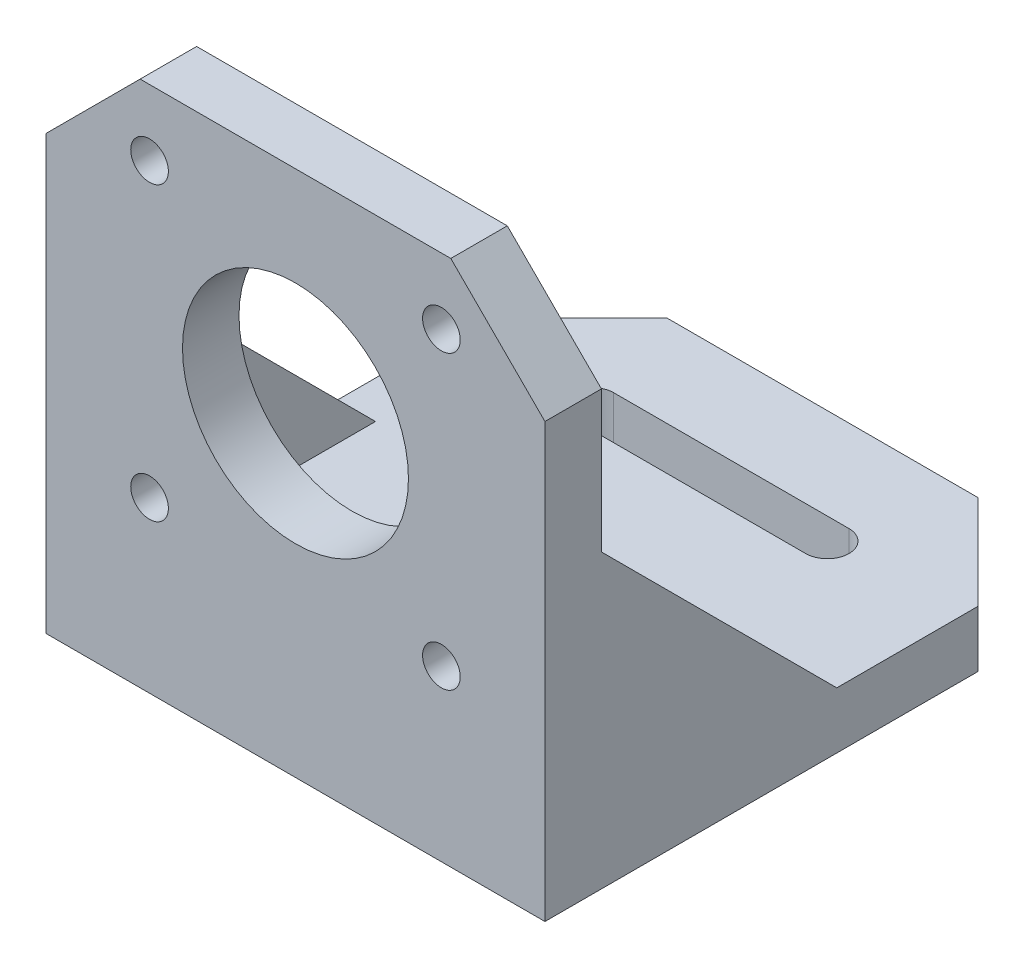
ISO-10303-21;
HEADER;
FILE_DESCRIPTION(('STEP AP214'),'2;1');
FILE_NAME('part.step','',(''),(''),'','','');
FILE_SCHEMA(('AUTOMOTIVE_DESIGN { 1 0 10303 214 1 1 1 1 }'));
ENDSEC;
DATA;
#1=APPLICATION_CONTEXT('core data for automotive mechanical design processes');
#2=APPLICATION_PROTOCOL_DEFINITION('international standard','automotive_design',2000,#1);
#3=PRODUCT_CONTEXT('',#1,'mechanical');
#4=PRODUCT('Part','Part','',(#3));
#5=PRODUCT_RELATED_PRODUCT_CATEGORY('part','',(#4));
#6=PRODUCT_DEFINITION_FORMATION('','',#4);
#7=PRODUCT_DEFINITION_CONTEXT('part definition',#1,'design');
#8=PRODUCT_DEFINITION('design','',#6,#7);
#9=PRODUCT_DEFINITION_SHAPE('','',#8);
#10=(LENGTH_UNIT() NAMED_UNIT(*) SI_UNIT(.MILLI.,.METRE.));
#11=(NAMED_UNIT(*) PLANE_ANGLE_UNIT() SI_UNIT($,.RADIAN.));
#12=(NAMED_UNIT(*) SI_UNIT($,.STERADIAN.) SOLID_ANGLE_UNIT());
#13=UNCERTAINTY_MEASURE_WITH_UNIT(LENGTH_MEASURE(1.E-05),#10,'distance_accuracy_value','');
#14=(GEOMETRIC_REPRESENTATION_CONTEXT(3) GLOBAL_UNCERTAINTY_ASSIGNED_CONTEXT((#13)) GLOBAL_UNIT_ASSIGNED_CONTEXT((#10,
#11,#12)) REPRESENTATION_CONTEXT('',''));
#15=CARTESIAN_POINT('',(0.,0.,0.));
#16=DIRECTION('',(0.,0.,1.));
#17=DIRECTION('',(1.,0.,0.));
#18=AXIS2_PLACEMENT_3D('',#15,#16,#17);
#19=CARTESIAN_POINT('',(4.,6.00000000000001,-31.));
#20=DIRECTION('',(0.,0.707106781186548,-0.707106781186547));
#21=DIRECTION('',(0.,0.707106781186547,0.707106781186548));
#22=AXIS2_PLACEMENT_3D('',#19,#20,#21);
#23=PLANE('',#22);
#24=DIRECTION('',(0.,-0.707106781186547,-0.707106781186548));
#25=VECTOR('',#24,1.);
#26=CARTESIAN_POINT('',(0.,6.00000000000001,-31.));
#27=LINE('',#26,#25);
#28=CARTESIAN_POINT('',(0.,31.,-5.99999999999999));
#29=VERTEX_POINT('',#28);
#30=CARTESIAN_POINT('',(0.,6.00000000000001,-31.));
#31=VERTEX_POINT('',#30);
#32=EDGE_CURVE('E97',#29,#31,#27,.T.);
#33=ORIENTED_EDGE('',*,*,#32,.F.);
#34=DIRECTION('',(-1.,0.,0.));
#35=VECTOR('',#34,1.);
#36=CARTESIAN_POINT('',(4.,31.,-5.99999999999999));
#37=LINE('',#36,#35);
#38=CARTESIAN_POINT('',(4.,31.,-5.99999999999999));
#39=VERTEX_POINT('',#38);
#40=EDGE_CURVE('E12',#39,#29,#37,.T.);
#41=ORIENTED_EDGE('',*,*,#40,.F.);
#42=DIRECTION('',(0.,-0.707106781186547,-0.707106781186548));
#43=VECTOR('',#42,1.);
#44=CARTESIAN_POINT('',(4.,6.00000000000001,-31.));
#45=LINE('',#44,#43);
#46=CARTESIAN_POINT('',(4.,6.00000000000001,-31.));
#47=VERTEX_POINT('',#46);
#48=EDGE_CURVE('E89',#39,#47,#45,.T.);
#49=ORIENTED_EDGE('',*,*,#48,.T.);
#50=DIRECTION('',(-1.,0.,0.));
#51=VECTOR('',#50,1.);
#52=CARTESIAN_POINT('',(4.,6.00000000000001,-31.));
#53=LINE('',#52,#51);
#54=EDGE_CURVE('E48',#47,#31,#53,.T.);
#55=ORIENTED_EDGE('',*,*,#54,.T.);
#56=EDGE_LOOP('',(#33,#41,#49,#55));
#57=FACE_BOUND('',#56,.T.);
#58=ADVANCED_FACE('F45',(#57),#23,.T.);
#59=CARTESIAN_POINT('',(4.,31.,-5.99999999999999));
#60=DIRECTION('',(0.,0.,1.));
#61=DIRECTION('',(0.,-1.,0.));
#62=AXIS2_PLACEMENT_3D('',#59,#60,#61);
#63=PLANE('',#62);
#64=DIRECTION('',(0.,1.,0.));
#65=VECTOR('',#64,1.);
#66=CARTESIAN_POINT('',(0.,31.,-5.99999999999999));
#67=LINE('',#66,#65);
#68=CARTESIAN_POINT('',(0.,6.00000000000001,-6.));
#69=VERTEX_POINT('',#68);
#70=EDGE_CURVE('E91',#69,#29,#67,.T.);
#71=ORIENTED_EDGE('',*,*,#70,.F.);
#72=DIRECTION('',(-1.,0.,0.));
#73=VECTOR('',#72,1.);
#74=CARTESIAN_POINT('',(4.,6.00000000000001,-6.));
#75=LINE('',#74,#73);
#76=CARTESIAN_POINT('',(4.,6.00000000000001,-6.));
#77=VERTEX_POINT('',#76);
#78=EDGE_CURVE('E54',#77,#69,#75,.T.);
#79=ORIENTED_EDGE('',*,*,#78,.F.);
#80=DIRECTION('',(0.,1.,0.));
#81=VECTOR('',#80,1.);
#82=CARTESIAN_POINT('',(4.,31.,-5.99999999999999));
#83=LINE('',#82,#81);
#84=EDGE_CURVE('E86',#77,#39,#83,.T.);
#85=ORIENTED_EDGE('',*,*,#84,.T.);
#86=ORIENTED_EDGE('',*,*,#40,.T.);
#87=EDGE_LOOP('',(#71,#79,#85,#86));
#88=FACE_BOUND('',#87,.T.);
#89=ADVANCED_FACE('F101',(#88),#63,.T.);
#90=CARTESIAN_POINT('',(4.,6.00000000000001,-6.));
#91=DIRECTION('',(0.,-1.,0.));
#92=DIRECTION('',(0.,0.,-1.));
#93=AXIS2_PLACEMENT_3D('',#90,#91,#92);
#94=PLANE('',#93);
#95=DIRECTION('',(0.,0.,1.));
#96=VECTOR('',#95,1.);
#97=CARTESIAN_POINT('',(0.,6.00000000000001,-6.));
#98=LINE('',#97,#96);
#99=EDGE_CURVE('E84',#31,#69,#98,.T.);
#100=ORIENTED_EDGE('',*,*,#99,.F.);
#101=ORIENTED_EDGE('',*,*,#54,.F.);
#102=DIRECTION('',(0.,0.,1.));
#103=VECTOR('',#102,1.);
#104=CARTESIAN_POINT('',(4.,6.00000000000001,-6.));
#105=LINE('',#104,#103);
#106=EDGE_CURVE('E82',#47,#77,#105,.T.);
#107=ORIENTED_EDGE('',*,*,#106,.T.);
#108=ORIENTED_EDGE('',*,*,#78,.T.);
#109=EDGE_LOOP('',(#100,#101,#107,#108));
#110=FACE_BOUND('',#109,.T.);
#111=ADVANCED_FACE('F81',(#110),#94,.T.);
#112=CARTESIAN_POINT('',(4.,0.,0.));
#113=DIRECTION('',(1.,0.,0.));
#114=DIRECTION('',(0.,0.,-1.));
#115=AXIS2_PLACEMENT_3D('',#112,#113,#114);
#116=PLANE('',#115);
#117=ORIENTED_EDGE('',*,*,#48,.F.);
#118=ORIENTED_EDGE('',*,*,#84,.F.);
#119=ORIENTED_EDGE('',*,*,#106,.F.);
#120=EDGE_LOOP('',(#117,#118,#119));
#121=FACE_BOUND('',#120,.T.);
#122=ADVANCED_FACE('F88',(#121),#116,.T.);
#123=CARTESIAN_POINT('',(0.,0.,0.));
#124=DIRECTION('',(1.,0.,0.));
#125=DIRECTION('',(0.,0.,-1.));
#126=AXIS2_PLACEMENT_3D('',#123,#124,#125);
#127=PLANE('',#126);
#128=ORIENTED_EDGE('',*,*,#32,.T.);
#129=ORIENTED_EDGE('',*,*,#99,.T.);
#130=ORIENTED_EDGE('',*,*,#70,.T.);
#131=EDGE_LOOP('',(#128,#129,#130));
#132=FACE_BOUND('',#131,.T.);
#133=ADVANCED_FACE('F100',(#132),#127,.F.);
#134=CLOSED_SHELL('',(#58,#89,#111,#122,#133));
#135=MANIFOLD_SOLID_BREP('B2',#134);
#136=CARTESIAN_POINT('',(53.,0.,-56.));
#137=DIRECTION('',(0.,1.,0.));
#138=DIRECTION('',(0.,0.,1.));
#139=AXIS2_PLACEMENT_3D('',#136,#137,#138);
#140=PLANE('',#139);
#141=DIRECTION('',(1.,0.,0.));
#142=VECTOR('',#141,1.);
#143=CARTESIAN_POINT('',(44.,0.,-11.7));
#144=LINE('',#143,#142);
#145=CARTESIAN_POINT('',(9.00000000000001,0.,-11.7));
#146=VERTEX_POINT('',#145);
#147=CARTESIAN_POINT('',(44.,0.,-11.7));
#148=VERTEX_POINT('',#147);
#149=EDGE_CURVE('E297',#146,#148,#144,.T.);
#150=ORIENTED_EDGE('',*,*,#149,.T.);
#151=CARTESIAN_POINT('',(44.,0.,-14.));
#152=DIRECTION('',(0.,1.,0.));
#153=DIRECTION('',(0.,0.,1.));
#154=AXIS2_PLACEMENT_3D('',#151,#152,#153);
#155=CIRCLE('',#154,2.3);
#156=CARTESIAN_POINT('',(44.,0.,-16.3));
#157=VERTEX_POINT('',#156);
#158=EDGE_CURVE('E289',#148,#157,#155,.T.);
#159=ORIENTED_EDGE('',*,*,#158,.T.);
#160=DIRECTION('',(-1.,0.,0.));
#161=VECTOR('',#160,1.);
#162=CARTESIAN_POINT('',(44.,0.,-16.3));
#163=LINE('',#162,#161);
#164=CARTESIAN_POINT('',(9.00000000000001,0.,-16.3));
#165=VERTEX_POINT('',#164);
#166=EDGE_CURVE('E301',#157,#165,#163,.T.);
#167=ORIENTED_EDGE('',*,*,#166,.T.);
#168=CARTESIAN_POINT('',(9.00000000000001,0.,-14.));
#169=DIRECTION('',(0.,1.,0.));
#170=DIRECTION('',(0.,0.,1.));
#171=AXIS2_PLACEMENT_3D('',#168,#169,#170);
#172=CIRCLE('',#171,2.3);
#173=EDGE_CURVE('E305',#165,#146,#172,.T.);
#174=ORIENTED_EDGE('',*,*,#173,.T.);
#175=EDGE_LOOP('',(#150,#159,#167,#174));
#176=FACE_BOUND('',#175,.T.);
#177=DIRECTION('',(1.,0.,0.));
#178=VECTOR('',#177,1.);
#179=CARTESIAN_POINT('',(39.,0.,-41.7));
#180=LINE('',#179,#178);
#181=CARTESIAN_POINT('',(14.,0.,-41.7));
#182=VERTEX_POINT('',#181);
#183=CARTESIAN_POINT('',(39.,0.,-41.7));
#184=VERTEX_POINT('',#183);
#185=EDGE_CURVE('E339',#182,#184,#180,.T.);
#186=ORIENTED_EDGE('',*,*,#185,.T.);
#187=CARTESIAN_POINT('',(39.,0.,-44.));
#188=DIRECTION('',(0.,1.,0.));
#189=DIRECTION('',(0.,0.,1.));
#190=AXIS2_PLACEMENT_3D('',#187,#188,#189);
#191=CIRCLE('',#190,2.29999999999999);
#192=CARTESIAN_POINT('',(39.,0.,-46.3));
#193=VERTEX_POINT('',#192);
#194=EDGE_CURVE('E329',#184,#193,#191,.T.);
#195=ORIENTED_EDGE('',*,*,#194,.T.);
#196=DIRECTION('',(-1.,0.,0.));
#197=VECTOR('',#196,1.);
#198=CARTESIAN_POINT('',(39.,0.,-46.3));
#199=LINE('',#198,#197);
#200=CARTESIAN_POINT('',(14.,0.,-46.3));
#201=VERTEX_POINT('',#200);
#202=EDGE_CURVE('E332',#193,#201,#199,.T.);
#203=ORIENTED_EDGE('',*,*,#202,.T.);
#204=CARTESIAN_POINT('',(14.,0.,-44.));
#205=DIRECTION('',(0.,1.,0.));
#206=DIRECTION('',(0.,0.,1.));
#207=AXIS2_PLACEMENT_3D('',#204,#205,#206);
#208=CIRCLE('',#207,2.29999999999999);
#209=EDGE_CURVE('E336',#201,#182,#208,.T.);
#210=ORIENTED_EDGE('',*,*,#209,.T.);
#211=EDGE_LOOP('',(#186,#195,#203,#210));
#212=FACE_BOUND('',#211,.T.);
#213=DIRECTION('',(0.,0.,-1.));
#214=VECTOR('',#213,1.);
#215=CARTESIAN_POINT('',(0.,0.,-56.));
#216=LINE('',#215,#214);
#217=CARTESIAN_POINT('',(0.,0.,0.));
#218=VERTEX_POINT('',#217);
#219=CARTESIAN_POINT('',(0.,0.,-46.));
#220=VERTEX_POINT('',#219);
#221=EDGE_CURVE('E393',#218,#220,#216,.T.);
#222=ORIENTED_EDGE('',*,*,#221,.T.);
#223=DIRECTION('',(0.707106781186547,0.,-0.707106781186548));
#224=VECTOR('',#223,1.);
#225=CARTESIAN_POINT('',(10.,0.,-56.));
#226=LINE('',#225,#224);
#227=CARTESIAN_POINT('',(10.,0.,-56.));
#228=VERTEX_POINT('',#227);
#229=EDGE_CURVE('E471',#220,#228,#226,.T.);
#230=ORIENTED_EDGE('',*,*,#229,.T.);
#231=DIRECTION('',(-1.,0.,0.));
#232=VECTOR('',#231,1.);
#233=CARTESIAN_POINT('',(53.,0.,-56.));
#234=LINE('',#233,#232);
#235=CARTESIAN_POINT('',(43.,0.,-56.));
#236=VERTEX_POINT('',#235);
#237=EDGE_CURVE('E426',#236,#228,#234,.T.);
#238=ORIENTED_EDGE('',*,*,#237,.F.);
#239=DIRECTION('',(-0.707106781186549,0.,-0.707106781186546));
#240=VECTOR('',#239,1.);
#241=CARTESIAN_POINT('',(53.,0.,-46.));
#242=LINE('',#241,#240);
#243=CARTESIAN_POINT('',(53.,0.,-46.));
#244=VERTEX_POINT('',#243);
#245=EDGE_CURVE('E469',#236,#244,#242,.F.);
#246=ORIENTED_EDGE('',*,*,#245,.T.);
#247=DIRECTION('',(0.,0.,-1.));
#248=VECTOR('',#247,1.);
#249=CARTESIAN_POINT('',(53.,0.,-56.));
#250=LINE('',#249,#248);
#251=CARTESIAN_POINT('',(53.,0.,0.));
#252=VERTEX_POINT('',#251);
#253=EDGE_CURVE('E396',#252,#244,#250,.T.);
#254=ORIENTED_EDGE('',*,*,#253,.F.);
#255=DIRECTION('',(-1.,0.,0.));
#256=VECTOR('',#255,1.);
#257=CARTESIAN_POINT('',(53.,0.,0.));
#258=LINE('',#257,#256);
#259=EDGE_CURVE('E407',#252,#218,#258,.T.);
#260=ORIENTED_EDGE('',*,*,#259,.T.);
#261=EDGE_LOOP('',(#222,#230,#238,#246,#254,#260));
#262=FACE_BOUND('',#261,.T.);
#263=ADVANCED_FACE('F143',(#176,#212,#262),#140,.F.);
#264=CARTESIAN_POINT('',(53.,6.00000000000001,-56.));
#265=DIRECTION('',(0.,0.,1.));
#266=DIRECTION('',(0.,-1.,0.));
#267=AXIS2_PLACEMENT_3D('',#264,#265,#266);
#268=PLANE('',#267);
#269=ORIENTED_EDGE('',*,*,#237,.T.);
#270=DIRECTION('',(0.,1.,0.));
#271=VECTOR('',#270,1.);
#272=CARTESIAN_POINT('',(10.,6.00000000000001,-56.));
#273=LINE('',#272,#271);
#274=CARTESIAN_POINT('',(10.,6.00000000000001,-56.));
#275=VERTEX_POINT('',#274);
#276=EDGE_CURVE('E460',#228,#275,#273,.T.);
#277=ORIENTED_EDGE('',*,*,#276,.T.);
#278=DIRECTION('',(-1.,0.,0.));
#279=VECTOR('',#278,1.);
#280=CARTESIAN_POINT('',(53.,6.00000000000001,-56.));
#281=LINE('',#280,#279);
#282=CARTESIAN_POINT('',(43.,6.00000000000001,-56.));
#283=VERTEX_POINT('',#282);
#284=EDGE_CURVE('E423',#283,#275,#281,.T.);
#285=ORIENTED_EDGE('',*,*,#284,.F.);
#286=DIRECTION('',(0.,-1.,0.));
#287=VECTOR('',#286,1.);
#288=CARTESIAN_POINT('',(43.,6.00000000000001,-56.));
#289=LINE('',#288,#287);
#290=EDGE_CURVE('E458',#283,#236,#289,.T.);
#291=ORIENTED_EDGE('',*,*,#290,.T.);
#292=EDGE_LOOP('',(#269,#277,#285,#291));
#293=FACE_BOUND('',#292,.T.);
#294=ADVANCED_FACE('F497',(#293),#268,.F.);
#295=CARTESIAN_POINT('',(53.,6.00000000000001,-6.));
#296=DIRECTION('',(0.,-1.,0.));
#297=DIRECTION('',(0.,0.,-1.));
#298=AXIS2_PLACEMENT_3D('',#295,#296,#297);
#299=PLANE('',#298);
#300=DIRECTION('',(-1.,0.,0.));
#301=VECTOR('',#300,1.);
#302=CARTESIAN_POINT('',(44.,6.00000000000001,-16.3));
#303=LINE('',#302,#301);
#304=CARTESIAN_POINT('',(44.,6.00000000000001,-16.3));
#305=VERTEX_POINT('',#304);
#306=CARTESIAN_POINT('',(9.00000000000001,6.00000000000001,-16.3));
#307=VERTEX_POINT('',#306);
#308=EDGE_CURVE('E318',#305,#307,#303,.T.);
#309=ORIENTED_EDGE('',*,*,#308,.F.);
#310=CARTESIAN_POINT('',(44.,6.00000000000001,-14.));
#311=DIRECTION('',(0.,1.,0.));
#312=DIRECTION('',(0.,0.,1.));
#313=AXIS2_PLACEMENT_3D('',#310,#311,#312);
#314=CIRCLE('',#313,2.3);
#315=CARTESIAN_POINT('',(44.,6.00000000000001,-11.7));
#316=VERTEX_POINT('',#315);
#317=EDGE_CURVE('E292',#316,#305,#314,.T.);
#318=ORIENTED_EDGE('',*,*,#317,.F.);
#319=DIRECTION('',(1.,0.,0.));
#320=VECTOR('',#319,1.);
#321=CARTESIAN_POINT('',(44.,6.00000000000001,-11.7));
#322=LINE('',#321,#320);
#323=CARTESIAN_POINT('',(9.00000000000001,6.00000000000001,-11.7));
#324=VERTEX_POINT('',#323);
#325=EDGE_CURVE('E309',#324,#316,#322,.T.);
#326=ORIENTED_EDGE('',*,*,#325,.F.);
#327=CARTESIAN_POINT('',(9.00000000000001,6.00000000000001,-14.));
#328=DIRECTION('',(0.,1.,0.));
#329=DIRECTION('',(0.,0.,1.));
#330=AXIS2_PLACEMENT_3D('',#327,#328,#329);
#331=CIRCLE('',#330,2.3);
#332=EDGE_CURVE('E312',#307,#324,#331,.T.);
#333=ORIENTED_EDGE('',*,*,#332,.F.);
#334=EDGE_LOOP('',(#309,#318,#326,#333));
#335=FACE_BOUND('',#334,.T.);
#336=DIRECTION('',(-1.,0.,0.));
#337=VECTOR('',#336,1.);
#338=CARTESIAN_POINT('',(39.,6.00000000000001,-46.3));
#339=LINE('',#338,#337);
#340=CARTESIAN_POINT('',(39.,6.00000000000001,-46.3));
#341=VERTEX_POINT('',#340);
#342=CARTESIAN_POINT('',(14.,6.00000000000001,-46.3));
#343=VERTEX_POINT('',#342);
#344=EDGE_CURVE('E345',#341,#343,#339,.T.);
#345=ORIENTED_EDGE('',*,*,#344,.F.);
#346=CARTESIAN_POINT('',(39.,6.00000000000001,-44.));
#347=DIRECTION('',(0.,1.,0.));
#348=DIRECTION('',(0.,0.,1.));
#349=AXIS2_PLACEMENT_3D('',#346,#347,#348);
#350=CIRCLE('',#349,2.29999999999999);
#351=CARTESIAN_POINT('',(39.,6.00000000000001,-41.7));
#352=VERTEX_POINT('',#351);
#353=EDGE_CURVE('E343',#352,#341,#350,.T.);
#354=ORIENTED_EDGE('',*,*,#353,.F.);
#355=DIRECTION('',(1.,0.,0.));
#356=VECTOR('',#355,1.);
#357=CARTESIAN_POINT('',(39.,6.00000000000001,-41.7));
#358=LINE('',#357,#356);
#359=CARTESIAN_POINT('',(14.,6.00000000000001,-41.7));
#360=VERTEX_POINT('',#359);
#361=EDGE_CURVE('E333',#360,#352,#358,.T.);
#362=ORIENTED_EDGE('',*,*,#361,.F.);
#363=CARTESIAN_POINT('',(14.,6.00000000000001,-44.));
#364=DIRECTION('',(0.,1.,0.));
#365=DIRECTION('',(0.,0.,1.));
#366=AXIS2_PLACEMENT_3D('',#363,#364,#365);
#367=CIRCLE('',#366,2.29999999999999);
#368=EDGE_CURVE('E348',#343,#360,#367,.T.);
#369=ORIENTED_EDGE('',*,*,#368,.F.);
#370=EDGE_LOOP('',(#345,#354,#362,#369));
#371=FACE_BOUND('',#370,.T.);
#372=DIRECTION('',(0.,0.,1.));
#373=VECTOR('',#372,1.);
#374=CARTESIAN_POINT('',(0.,6.00000000000001,-6.));
#375=LINE('',#374,#373);
#376=CARTESIAN_POINT('',(0.,6.00000000000001,-46.));
#377=VERTEX_POINT('',#376);
#378=CARTESIAN_POINT('',(0.,6.00000000000001,-9.));
#379=VERTEX_POINT('',#378);
#380=EDGE_CURVE('E410',#377,#379,#375,.T.);
#381=ORIENTED_EDGE('',*,*,#380,.T.);
#382=DIRECTION('',(-1.,0.,0.));
#383=VECTOR('',#382,1.);
#384=CARTESIAN_POINT('',(49.,6.00000000000001,-9.));
#385=LINE('',#384,#383);
#386=CARTESIAN_POINT('',(49.,6.00000000000001,-9.));
#387=VERTEX_POINT('',#386);
#388=EDGE_CURVE('E158',#379,#387,#385,.F.);
#389=ORIENTED_EDGE('',*,*,#388,.T.);
#390=DIRECTION('',(0.,0.,-1.));
#391=VECTOR('',#390,1.);
#392=CARTESIAN_POINT('',(49.,6.00000000000001,-31.));
#393=LINE('',#392,#391);
#394=CARTESIAN_POINT('',(49.,6.00000000000001,-31.));
#395=VERTEX_POINT('',#394);
#396=EDGE_CURVE('E383',#387,#395,#393,.T.);
#397=ORIENTED_EDGE('',*,*,#396,.T.);
#398=DIRECTION('',(1.,0.,0.));
#399=VECTOR('',#398,1.);
#400=CARTESIAN_POINT('',(49.,6.00000000000001,-31.));
#401=LINE('',#400,#399);
#402=CARTESIAN_POINT('',(53.,6.00000000000001,-31.));
#403=VERTEX_POINT('',#402);
#404=EDGE_CURVE('E388',#395,#403,#401,.T.);
#405=ORIENTED_EDGE('',*,*,#404,.T.);
#406=DIRECTION('',(0.,0.,1.));
#407=VECTOR('',#406,1.);
#408=CARTESIAN_POINT('',(53.,6.00000000000001,-6.));
#409=LINE('',#408,#407);
#410=CARTESIAN_POINT('',(53.,6.00000000000001,-46.));
#411=VERTEX_POINT('',#410);
#412=EDGE_CURVE('E399',#411,#403,#409,.T.);
#413=ORIENTED_EDGE('',*,*,#412,.F.);
#414=DIRECTION('',(0.707106781186549,0.,0.707106781186546));
#415=VECTOR('',#414,1.);
#416=CARTESIAN_POINT('',(53.,6.00000000000001,-46.));
#417=LINE('',#416,#415);
#418=EDGE_CURVE('E463',#411,#283,#417,.F.);
#419=ORIENTED_EDGE('',*,*,#418,.T.);
#420=ORIENTED_EDGE('',*,*,#284,.T.);
#421=DIRECTION('',(-0.707106781186547,0.,0.707106781186548));
#422=VECTOR('',#421,1.);
#423=CARTESIAN_POINT('',(10.,6.00000000000001,-56.));
#424=LINE('',#423,#422);
#425=EDGE_CURVE('E465',#275,#377,#424,.T.);
#426=ORIENTED_EDGE('',*,*,#425,.T.);
#427=EDGE_LOOP('',(#381,#389,#397,#405,#413,#419,#420,#426));
#428=FACE_BOUND('',#427,.T.);
#429=ADVANCED_FACE('F502',(#335,#371,#428),#299,.F.);
#430=CARTESIAN_POINT('',(53.,56.,-5.99999999999999));
#431=DIRECTION('',(0.,0.,1.));
#432=DIRECTION('',(0.,-1.,0.));
#433=AXIS2_PLACEMENT_3D('',#430,#431,#432);
#434=PLANE('',#433);
#435=CARTESIAN_POINT('',(26.5,33.5,-5.99999999999999));
#436=DIRECTION('',(0.,0.,1.));
#437=DIRECTION('',(0.,-1.,0.));
#438=AXIS2_PLACEMENT_3D('',#435,#436,#437);
#439=CIRCLE('',#438,12.);
#440=CARTESIAN_POINT('',(26.5,21.5,-5.99999999999999));
#441=VERTEX_POINT('',#440);
#442=EDGE_CURVE('E376',#441,#441,#439,.T.);
#443=ORIENTED_EDGE('',*,*,#442,.T.);
#444=EDGE_LOOP('',(#443));
#445=FACE_BOUND('',#444,.T.);
#446=CARTESIAN_POINT('',(11.,18.,-6.));
#447=DIRECTION('',(0.,0.,1.));
#448=DIRECTION('',(0.,-1.,0.));
#449=AXIS2_PLACEMENT_3D('',#446,#447,#448);
#450=CIRCLE('',#449,2.);
#451=CARTESIAN_POINT('',(11.,16.,-6.));
#452=VERTEX_POINT('',#451);
#453=EDGE_CURVE('E372',#452,#452,#450,.T.);
#454=ORIENTED_EDGE('',*,*,#453,.T.);
#455=EDGE_LOOP('',(#454));
#456=FACE_BOUND('',#455,.T.);
#457=CARTESIAN_POINT('',(42.,18.,-6.));
#458=DIRECTION('',(0.,0.,1.));
#459=DIRECTION('',(0.,-1.,0.));
#460=AXIS2_PLACEMENT_3D('',#457,#458,#459);
#461=CIRCLE('',#460,2.);
#462=CARTESIAN_POINT('',(42.,16.,-6.));
#463=VERTEX_POINT('',#462);
#464=EDGE_CURVE('E368',#463,#463,#461,.T.);
#465=ORIENTED_EDGE('',*,*,#464,.T.);
#466=EDGE_LOOP('',(#465));
#467=FACE_BOUND('',#466,.T.);
#468=CARTESIAN_POINT('',(42.,49.,-5.99999999999999));
#469=DIRECTION('',(0.,0.,1.));
#470=DIRECTION('',(0.,-1.,0.));
#471=AXIS2_PLACEMENT_3D('',#468,#469,#470);
#472=CIRCLE('',#471,2.);
#473=CARTESIAN_POINT('',(42.,47.,-5.99999999999999));
#474=VERTEX_POINT('',#473);
#475=EDGE_CURVE('E364',#474,#474,#472,.T.);
#476=ORIENTED_EDGE('',*,*,#475,.T.);
#477=EDGE_LOOP('',(#476));
#478=FACE_BOUND('',#477,.T.);
#479=CARTESIAN_POINT('',(11.,49.,-5.99999999999999));
#480=DIRECTION('',(0.,0.,1.));
#481=DIRECTION('',(0.,-1.,0.));
#482=AXIS2_PLACEMENT_3D('',#479,#480,#481);
#483=CIRCLE('',#482,2.);
#484=CARTESIAN_POINT('',(11.,47.,-5.99999999999999));
#485=VERTEX_POINT('',#484);
#486=EDGE_CURVE('E360',#485,#485,#483,.T.);
#487=ORIENTED_EDGE('',*,*,#486,.T.);
#488=EDGE_LOOP('',(#487));
#489=FACE_BOUND('',#488,.T.);
#490=DIRECTION('',(0.,-1.,0.));
#491=VECTOR('',#490,1.);
#492=CARTESIAN_POINT('',(49.,6.00000000000001,-6.));
#493=LINE('',#492,#491);
#494=CARTESIAN_POINT('',(49.,31.,-5.99999999999999));
#495=VERTEX_POINT('',#494);
#496=CARTESIAN_POINT('',(49.,9.00000000000001,-6.));
#497=VERTEX_POINT('',#496);
#498=EDGE_CURVE('E380',#495,#497,#493,.T.);
#499=ORIENTED_EDGE('',*,*,#498,.T.);
#500=DIRECTION('',(-1.,0.,0.));
#501=VECTOR('',#500,1.);
#502=CARTESIAN_POINT('',(0.,9.00000000000001,-6.));
#503=LINE('',#502,#501);
#504=CARTESIAN_POINT('',(0.,9.00000000000002,-6.));
#505=VERTEX_POINT('',#504);
#506=EDGE_CURVE('E476',#497,#505,#503,.T.);
#507=ORIENTED_EDGE('',*,*,#506,.T.);
#508=DIRECTION('',(0.,1.,0.));
#509=VECTOR('',#508,1.);
#510=CARTESIAN_POINT('',(0.,56.,-5.99999999999999));
#511=LINE('',#510,#509);
#512=CARTESIAN_POINT('',(0.,46.,-5.99999999999999));
#513=VERTEX_POINT('',#512);
#514=EDGE_CURVE('E412',#505,#513,#511,.T.);
#515=ORIENTED_EDGE('',*,*,#514,.T.);
#516=DIRECTION('',(0.707106781186547,0.707106781186549,0.));
#517=VECTOR('',#516,1.);
#518=CARTESIAN_POINT('',(10.,56.,-5.99999999999999));
#519=LINE('',#518,#517);
#520=CARTESIAN_POINT('',(10.,56.,-5.99999999999999));
#521=VERTEX_POINT('',#520);
#522=EDGE_CURVE('E451',#513,#521,#519,.T.);
#523=ORIENTED_EDGE('',*,*,#522,.T.);
#524=DIRECTION('',(-1.,0.,0.));
#525=VECTOR('',#524,1.);
#526=CARTESIAN_POINT('',(53.,56.,-5.99999999999999));
#527=LINE('',#526,#525);
#528=CARTESIAN_POINT('',(43.,56.,-5.99999999999999));
#529=VERTEX_POINT('',#528);
#530=EDGE_CURVE('E420',#529,#521,#527,.T.);
#531=ORIENTED_EDGE('',*,*,#530,.F.);
#532=DIRECTION('',(-0.707106781186549,0.707106781186546,0.));
#533=VECTOR('',#532,1.);
#534=CARTESIAN_POINT('',(53.,46.,-5.99999999999999));
#535=LINE('',#534,#533);
#536=CARTESIAN_POINT('',(53.,46.,-5.99999999999999));
#537=VERTEX_POINT('',#536);
#538=EDGE_CURVE('E453',#529,#537,#535,.F.);
#539=ORIENTED_EDGE('',*,*,#538,.T.);
#540=DIRECTION('',(0.,1.,0.));
#541=VECTOR('',#540,1.);
#542=CARTESIAN_POINT('',(53.,56.,-5.99999999999999));
#543=LINE('',#542,#541);
#544=CARTESIAN_POINT('',(53.,31.,-5.99999999999999));
#545=VERTEX_POINT('',#544);
#546=EDGE_CURVE('E402',#545,#537,#543,.T.);
#547=ORIENTED_EDGE('',*,*,#546,.F.);
#548=DIRECTION('',(1.,0.,0.));
#549=VECTOR('',#548,1.);
#550=CARTESIAN_POINT('',(49.,31.,-5.99999999999999));
#551=LINE('',#550,#549);
#552=EDGE_CURVE('E391',#495,#545,#551,.T.);
#553=ORIENTED_EDGE('',*,*,#552,.F.);
#554=EDGE_LOOP('',(#499,#507,#515,#523,#531,#539,#547,#553));
#555=FACE_BOUND('',#554,.T.);
#556=ADVANCED_FACE('F487',(#445,#456,#467,#478,#489,#555),#434,.F.);
#557=CARTESIAN_POINT('',(53.,56.,0.));
#558=DIRECTION('',(0.,-1.,0.));
#559=DIRECTION('',(0.,0.,-1.));
#560=AXIS2_PLACEMENT_3D('',#557,#558,#559);
#561=PLANE('',#560);
#562=DIRECTION('',(-1.,0.,0.));
#563=VECTOR('',#562,1.);
#564=CARTESIAN_POINT('',(53.,56.,0.));
#565=LINE('',#564,#563);
#566=CARTESIAN_POINT('',(43.,56.,0.));
#567=VERTEX_POINT('',#566);
#568=CARTESIAN_POINT('',(10.,56.,0.));
#569=VERTEX_POINT('',#568);
#570=EDGE_CURVE('E417',#567,#569,#565,.T.);
#571=ORIENTED_EDGE('',*,*,#570,.F.);
#572=DIRECTION('',(0.,0.,-1.));
#573=VECTOR('',#572,1.);
#574=CARTESIAN_POINT('',(43.,56.,0.));
#575=LINE('',#574,#573);
#576=EDGE_CURVE('E449',#567,#529,#575,.T.);
#577=ORIENTED_EDGE('',*,*,#576,.T.);
#578=ORIENTED_EDGE('',*,*,#530,.T.);
#579=DIRECTION('',(0.,0.,1.));
#580=VECTOR('',#579,1.);
#581=CARTESIAN_POINT('',(10.,56.,0.));
#582=LINE('',#581,#580);
#583=EDGE_CURVE('E446',#521,#569,#582,.T.);
#584=ORIENTED_EDGE('',*,*,#583,.T.);
#585=EDGE_LOOP('',(#571,#577,#578,#584));
#586=FACE_BOUND('',#585,.T.);
#587=ADVANCED_FACE('F565',(#586),#561,.F.);
#588=CARTESIAN_POINT('',(53.,0.,0.));
#589=DIRECTION('',(0.,0.,-1.));
#590=DIRECTION('',(-1.,0.,0.));
#591=AXIS2_PLACEMENT_3D('',#588,#589,#590);
#592=PLANE('',#591);
#593=CARTESIAN_POINT('',(26.5,33.5,0.));
#594=DIRECTION('',(0.,0.,-1.));
#595=DIRECTION('',(-1.,0.,0.));
#596=AXIS2_PLACEMENT_3D('',#593,#594,#595);
#597=CIRCLE('',#596,12.);
#598=CARTESIAN_POINT('',(14.5,33.5,0.));
#599=VERTEX_POINT('',#598);
#600=EDGE_CURVE('E375',#599,#599,#597,.T.);
#601=ORIENTED_EDGE('',*,*,#600,.T.);
#602=EDGE_LOOP('',(#601));
#603=FACE_BOUND('',#602,.T.);
#604=CARTESIAN_POINT('',(11.,18.,0.));
#605=DIRECTION('',(0.,0.,-1.));
#606=DIRECTION('',(-1.,0.,0.));
#607=AXIS2_PLACEMENT_3D('',#604,#605,#606);
#608=CIRCLE('',#607,2.);
#609=CARTESIAN_POINT('',(9.,18.,0.));
#610=VERTEX_POINT('',#609);
#611=EDGE_CURVE('E371',#610,#610,#608,.T.);
#612=ORIENTED_EDGE('',*,*,#611,.T.);
#613=EDGE_LOOP('',(#612));
#614=FACE_BOUND('',#613,.T.);
#615=CARTESIAN_POINT('',(42.,18.,0.));
#616=DIRECTION('',(0.,0.,-1.));
#617=DIRECTION('',(-1.,0.,0.));
#618=AXIS2_PLACEMENT_3D('',#615,#616,#617);
#619=CIRCLE('',#618,2.);
#620=CARTESIAN_POINT('',(40.,18.,0.));
#621=VERTEX_POINT('',#620);
#622=EDGE_CURVE('E367',#621,#621,#619,.T.);
#623=ORIENTED_EDGE('',*,*,#622,.T.);
#624=EDGE_LOOP('',(#623));
#625=FACE_BOUND('',#624,.T.);
#626=CARTESIAN_POINT('',(42.,49.,0.));
#627=DIRECTION('',(0.,0.,-1.));
#628=DIRECTION('',(-1.,0.,0.));
#629=AXIS2_PLACEMENT_3D('',#626,#627,#628);
#630=CIRCLE('',#629,2.);
#631=CARTESIAN_POINT('',(40.,49.,0.));
#632=VERTEX_POINT('',#631);
#633=EDGE_CURVE('E363',#632,#632,#630,.T.);
#634=ORIENTED_EDGE('',*,*,#633,.T.);
#635=EDGE_LOOP('',(#634));
#636=FACE_BOUND('',#635,.T.);
#637=CARTESIAN_POINT('',(11.,49.,0.));
#638=DIRECTION('',(0.,0.,-1.));
#639=DIRECTION('',(-1.,0.,0.));
#640=AXIS2_PLACEMENT_3D('',#637,#638,#639);
#641=CIRCLE('',#640,2.);
#642=CARTESIAN_POINT('',(9.,49.,0.));
#643=VERTEX_POINT('',#642);
#644=EDGE_CURVE('E325',#643,#643,#641,.T.);
#645=ORIENTED_EDGE('',*,*,#644,.T.);
#646=EDGE_LOOP('',(#645));
#647=FACE_BOUND('',#646,.T.);
#648=DIRECTION('',(0.,-1.,0.));
#649=VECTOR('',#648,1.);
#650=CARTESIAN_POINT('',(53.,0.,0.));
#651=LINE('',#650,#649);
#652=CARTESIAN_POINT('',(53.,46.,0.));
#653=VERTEX_POINT('',#652);
#654=EDGE_CURVE('E405',#653,#252,#651,.T.);
#655=ORIENTED_EDGE('',*,*,#654,.F.);
#656=DIRECTION('',(0.707106781186549,-0.707106781186546,0.));
#657=VECTOR('',#656,1.);
#658=CARTESIAN_POINT('',(53.,46.,0.));
#659=LINE('',#658,#657);
#660=EDGE_CURVE('E444',#653,#567,#659,.F.);
#661=ORIENTED_EDGE('',*,*,#660,.T.);
#662=ORIENTED_EDGE('',*,*,#570,.T.);
#663=DIRECTION('',(-0.707106781186547,-0.707106781186549,0.));
#664=VECTOR('',#663,1.);
#665=CARTESIAN_POINT('',(10.,56.,0.));
#666=LINE('',#665,#664);
#667=CARTESIAN_POINT('',(0.,45.9999999999999,0.));
#668=VERTEX_POINT('',#667);
#669=EDGE_CURVE('E442',#569,#668,#666,.T.);
#670=ORIENTED_EDGE('',*,*,#669,.T.);
#671=DIRECTION('',(0.,-1.,0.));
#672=VECTOR('',#671,1.);
#673=CARTESIAN_POINT('',(0.,0.,0.));
#674=LINE('',#673,#672);
#675=EDGE_CURVE('E400',#668,#218,#674,.T.);
#676=ORIENTED_EDGE('',*,*,#675,.T.);
#677=ORIENTED_EDGE('',*,*,#259,.F.);
#678=EDGE_LOOP('',(#655,#661,#662,#670,#676,#677));
#679=FACE_BOUND('',#678,.T.);
#680=ADVANCED_FACE('F542',(#603,#614,#625,#636,#647,#679),#592,.F.);
#681=CARTESIAN_POINT('',(53.,0.,0.));
#682=DIRECTION('',(-1.,0.,0.));
#683=DIRECTION('',(0.,0.,1.));
#684=AXIS2_PLACEMENT_3D('',#681,#682,#683);
#685=PLANE('',#684);
#686=ORIENTED_EDGE('',*,*,#253,.T.);
#687=DIRECTION('',(0.,1.,0.));
#688=VECTOR('',#687,1.);
#689=CARTESIAN_POINT('',(53.,0.,-46.));
#690=LINE('',#689,#688);
#691=EDGE_CURVE('E473',#244,#411,#690,.T.);
#692=ORIENTED_EDGE('',*,*,#691,.T.);
#693=ORIENTED_EDGE('',*,*,#412,.T.);
#694=DIRECTION('',(0.,0.707106781186547,0.707106781186548));
#695=VECTOR('',#694,1.);
#696=CARTESIAN_POINT('',(53.,31.,-5.99999999999999));
#697=LINE('',#696,#695);
#698=EDGE_CURVE('E379',#403,#545,#697,.T.);
#699=ORIENTED_EDGE('',*,*,#698,.T.);
#700=ORIENTED_EDGE('',*,*,#546,.T.);
#701=DIRECTION('',(0.,0.,1.));
#702=VECTOR('',#701,1.);
#703=CARTESIAN_POINT('',(53.,46.,1.06396373193244E-13));
#704=LINE('',#703,#702);
#705=EDGE_CURVE('E429',#537,#653,#704,.T.);
#706=ORIENTED_EDGE('',*,*,#705,.T.);
#707=ORIENTED_EDGE('',*,*,#654,.T.);
#708=EDGE_LOOP('',(#686,#692,#693,#699,#700,#706,#707));
#709=FACE_BOUND('',#708,.T.);
#710=ADVANCED_FACE('F536',(#709),#685,.F.);
#711=CARTESIAN_POINT('',(0.,0.,0.));
#712=DIRECTION('',(-1.,0.,0.));
#713=DIRECTION('',(0.,0.,1.));
#714=AXIS2_PLACEMENT_3D('',#711,#712,#713);
#715=PLANE('',#714);
#716=ORIENTED_EDGE('',*,*,#380,.F.);
#717=DIRECTION('',(0.,-1.,0.));
#718=VECTOR('',#717,1.);
#719=CARTESIAN_POINT('',(0.,0.,-46.));
#720=LINE('',#719,#718);
#721=EDGE_CURVE('E467',#377,#220,#720,.T.);
#722=ORIENTED_EDGE('',*,*,#721,.T.);
#723=ORIENTED_EDGE('',*,*,#221,.F.);
#724=ORIENTED_EDGE('',*,*,#675,.F.);
#725=DIRECTION('',(0.,0.,-1.));
#726=VECTOR('',#725,1.);
#727=CARTESIAN_POINT('',(0.,46.,-6.00000000000001));
#728=LINE('',#727,#726);
#729=EDGE_CURVE('E455',#668,#513,#728,.T.);
#730=ORIENTED_EDGE('',*,*,#729,.T.);
#731=ORIENTED_EDGE('',*,*,#514,.F.);
#732=CARTESIAN_POINT('',(0.,9.00000000000001,-9.));
#733=DIRECTION('',(-1.,0.,0.));
#734=DIRECTION('',(0.,0.,1.));
#735=AXIS2_PLACEMENT_3D('',#732,#733,#734);
#736=CIRCLE('',#735,3.);
#737=EDGE_CURVE('E43',#505,#379,#736,.F.);
#738=ORIENTED_EDGE('',*,*,#737,.T.);
#739=EDGE_LOOP('',(#716,#722,#723,#724,#730,#731,#738));
#740=FACE_BOUND('',#739,.T.);
#741=ADVANCED_FACE('F544',(#740),#715,.T.);
#742=CARTESIAN_POINT('',(49.,31.,-5.99999999999999));
#743=DIRECTION('',(0.,0.707106781186548,-0.707106781186547));
#744=DIRECTION('',(0.,0.707106781186547,0.707106781186548));
#745=AXIS2_PLACEMENT_3D('',#742,#743,#744);
#746=PLANE('',#745);
#747=ORIENTED_EDGE('',*,*,#698,.F.);
#748=ORIENTED_EDGE('',*,*,#404,.F.);
#749=DIRECTION('',(0.,0.707106781186547,0.707106781186548));
#750=VECTOR('',#749,1.);
#751=CARTESIAN_POINT('',(49.,31.,-5.99999999999999));
#752=LINE('',#751,#750);
#753=EDGE_CURVE('E385',#395,#495,#752,.T.);
#754=ORIENTED_EDGE('',*,*,#753,.T.);
#755=ORIENTED_EDGE('',*,*,#552,.T.);
#756=EDGE_LOOP('',(#747,#748,#754,#755));
#757=FACE_BOUND('',#756,.T.);
#758=ADVANCED_FACE('F549',(#757),#746,.T.);
#759=CARTESIAN_POINT('',(49.,0.,0.));
#760=DIRECTION('',(1.,0.,0.));
#761=DIRECTION('',(0.,0.,-1.));
#762=AXIS2_PLACEMENT_3D('',#759,#760,#761);
#763=PLANE('',#762);
#764=ORIENTED_EDGE('',*,*,#396,.F.);
#765=CARTESIAN_POINT('',(49.,9.00000000000001,-9.));
#766=DIRECTION('',(1.,0.,0.));
#767=DIRECTION('',(0.,0.,-1.));
#768=AXIS2_PLACEMENT_3D('',#765,#766,#767);
#769=CIRCLE('',#768,3.);
#770=EDGE_CURVE('E151',#387,#497,#769,.F.);
#771=ORIENTED_EDGE('',*,*,#770,.T.);
#772=ORIENTED_EDGE('',*,*,#498,.F.);
#773=ORIENTED_EDGE('',*,*,#753,.F.);
#774=EDGE_LOOP('',(#764,#771,#772,#773));
#775=FACE_BOUND('',#774,.T.);
#776=ADVANCED_FACE('F481',(#775),#763,.F.);
#777=CARTESIAN_POINT('',(11.,49.,-56.));
#778=DIRECTION('',(0.,0.,1.));
#779=DIRECTION('',(1.,0.,0.));
#780=AXIS2_PLACEMENT_3D('',#777,#778,#779);
#781=CYLINDRICAL_SURFACE('',#780,2.);
#782=ORIENTED_EDGE('',*,*,#644,.F.);
#783=EDGE_LOOP('',(#782));
#784=FACE_BOUND('',#783,.T.);
#785=ORIENTED_EDGE('',*,*,#486,.F.);
#786=EDGE_LOOP('',(#785));
#787=FACE_BOUND('',#786,.T.);
#788=ADVANCED_FACE('F556',(#784,#787),#781,.F.);
#789=CARTESIAN_POINT('',(42.,49.,-56.));
#790=DIRECTION('',(0.,0.,1.));
#791=DIRECTION('',(1.,0.,0.));
#792=AXIS2_PLACEMENT_3D('',#789,#790,#791);
#793=CYLINDRICAL_SURFACE('',#792,2.);
#794=ORIENTED_EDGE('',*,*,#633,.F.);
#795=EDGE_LOOP('',(#794));
#796=FACE_BOUND('',#795,.T.);
#797=ORIENTED_EDGE('',*,*,#475,.F.);
#798=EDGE_LOOP('',(#797));
#799=FACE_BOUND('',#798,.T.);
#800=ADVANCED_FACE('F605',(#796,#799),#793,.F.);
#801=CARTESIAN_POINT('',(42.,18.,-56.));
#802=DIRECTION('',(0.,0.,1.));
#803=DIRECTION('',(1.,0.,0.));
#804=AXIS2_PLACEMENT_3D('',#801,#802,#803);
#805=CYLINDRICAL_SURFACE('',#804,2.);
#806=ORIENTED_EDGE('',*,*,#622,.F.);
#807=EDGE_LOOP('',(#806));
#808=FACE_BOUND('',#807,.T.);
#809=ORIENTED_EDGE('',*,*,#464,.F.);
#810=EDGE_LOOP('',(#809));
#811=FACE_BOUND('',#810,.T.);
#812=ADVANCED_FACE('F608',(#808,#811),#805,.F.);
#813=CARTESIAN_POINT('',(11.,18.,-56.));
#814=DIRECTION('',(0.,0.,1.));
#815=DIRECTION('',(1.,0.,0.));
#816=AXIS2_PLACEMENT_3D('',#813,#814,#815);
#817=CYLINDRICAL_SURFACE('',#816,2.);
#818=ORIENTED_EDGE('',*,*,#611,.F.);
#819=EDGE_LOOP('',(#818));
#820=FACE_BOUND('',#819,.T.);
#821=ORIENTED_EDGE('',*,*,#453,.F.);
#822=EDGE_LOOP('',(#821));
#823=FACE_BOUND('',#822,.T.);
#824=ADVANCED_FACE('F612',(#820,#823),#817,.F.);
#825=CARTESIAN_POINT('',(26.5,33.5,-56.));
#826=DIRECTION('',(0.,0.,1.));
#827=DIRECTION('',(1.,0.,0.));
#828=AXIS2_PLACEMENT_3D('',#825,#826,#827);
#829=CYLINDRICAL_SURFACE('',#828,12.);
#830=ORIENTED_EDGE('',*,*,#600,.F.);
#831=EDGE_LOOP('',(#830));
#832=FACE_BOUND('',#831,.T.);
#833=ORIENTED_EDGE('',*,*,#442,.F.);
#834=EDGE_LOOP('',(#833));
#835=FACE_BOUND('',#834,.T.);
#836=ADVANCED_FACE('F511',(#832,#835),#829,.F.);
#837=CARTESIAN_POINT('',(53.,46.,1.06396373193244E-13));
#838=DIRECTION('',(-0.707106781186546,-0.707106781186549,0.));
#839=DIRECTION('',(0.,0.,1.));
#840=AXIS2_PLACEMENT_3D('',#837,#838,#839);
#841=PLANE('',#840);
#842=ORIENTED_EDGE('',*,*,#538,.F.);
#843=ORIENTED_EDGE('',*,*,#576,.F.);
#844=ORIENTED_EDGE('',*,*,#660,.F.);
#845=ORIENTED_EDGE('',*,*,#705,.F.);
#846=EDGE_LOOP('',(#842,#843,#844,#845));
#847=FACE_BOUND('',#846,.T.);
#848=ADVANCED_FACE('F507',(#847),#841,.F.);
#849=CARTESIAN_POINT('',(10.,56.,0.));
#850=DIRECTION('',(-0.707106781186549,0.707106781186547,0.));
#851=DIRECTION('',(0.,0.,-1.));
#852=AXIS2_PLACEMENT_3D('',#849,#850,#851);
#853=PLANE('',#852);
#854=ORIENTED_EDGE('',*,*,#522,.F.);
#855=ORIENTED_EDGE('',*,*,#729,.F.);
#856=ORIENTED_EDGE('',*,*,#669,.F.);
#857=ORIENTED_EDGE('',*,*,#583,.F.);
#858=EDGE_LOOP('',(#854,#855,#856,#857));
#859=FACE_BOUND('',#858,.T.);
#860=ADVANCED_FACE('F510',(#859),#853,.T.);
#861=CARTESIAN_POINT('',(39.,0.,-44.));
#862=DIRECTION('',(0.,1.,0.));
#863=DIRECTION('',(0.,0.,1.));
#864=AXIS2_PLACEMENT_3D('',#861,#862,#863);
#865=CYLINDRICAL_SURFACE('',#864,2.29999999999999);
#866=ORIENTED_EDGE('',*,*,#353,.T.);
#867=DIRECTION('',(0.,1.,0.));
#868=VECTOR('',#867,1.);
#869=CARTESIAN_POINT('',(39.,0.,-46.3));
#870=LINE('',#869,#868);
#871=EDGE_CURVE('E342',#193,#341,#870,.T.);
#872=ORIENTED_EDGE('',*,*,#871,.F.);
#873=ORIENTED_EDGE('',*,*,#194,.F.);
#874=DIRECTION('',(0.,1.,0.));
#875=VECTOR('',#874,1.);
#876=CARTESIAN_POINT('',(39.,0.,-41.7));
#877=LINE('',#876,#875);
#878=EDGE_CURVE('E319',#184,#352,#877,.T.);
#879=ORIENTED_EDGE('',*,*,#878,.T.);
#880=EDGE_LOOP('',(#866,#872,#873,#879));
#881=FACE_BOUND('',#880,.T.);
#882=ADVANCED_FACE('F515',(#881),#865,.F.);
#883=CARTESIAN_POINT('',(39.,0.,-41.7));
#884=DIRECTION('',(0.,0.,1.));
#885=DIRECTION('',(0.,-1.,0.));
#886=AXIS2_PLACEMENT_3D('',#883,#884,#885);
#887=PLANE('',#886);
#888=ORIENTED_EDGE('',*,*,#361,.T.);
#889=ORIENTED_EDGE('',*,*,#878,.F.);
#890=ORIENTED_EDGE('',*,*,#185,.F.);
#891=DIRECTION('',(0.,1.,0.));
#892=VECTOR('',#891,1.);
#893=CARTESIAN_POINT('',(14.,0.,-41.7));
#894=LINE('',#893,#892);
#895=EDGE_CURVE('E354',#182,#360,#894,.T.);
#896=ORIENTED_EDGE('',*,*,#895,.T.);
#897=EDGE_LOOP('',(#888,#889,#890,#896));
#898=FACE_BOUND('',#897,.T.);
#899=ADVANCED_FACE('F590',(#898),#887,.F.);
#900=CARTESIAN_POINT('',(14.,0.,-44.));
#901=DIRECTION('',(0.,1.,0.));
#902=DIRECTION('',(0.,0.,1.));
#903=AXIS2_PLACEMENT_3D('',#900,#901,#902);
#904=CYLINDRICAL_SURFACE('',#903,2.29999999999999);
#905=ORIENTED_EDGE('',*,*,#368,.T.);
#906=ORIENTED_EDGE('',*,*,#895,.F.);
#907=ORIENTED_EDGE('',*,*,#209,.F.);
#908=DIRECTION('',(0.,1.,0.));
#909=VECTOR('',#908,1.);
#910=CARTESIAN_POINT('',(14.,0.,-46.3));
#911=LINE('',#910,#909);
#912=EDGE_CURVE('E356',#201,#343,#911,.T.);
#913=ORIENTED_EDGE('',*,*,#912,.T.);
#914=EDGE_LOOP('',(#905,#906,#907,#913));
#915=FACE_BOUND('',#914,.T.);
#916=ADVANCED_FACE('F592',(#915),#904,.F.);
#917=CARTESIAN_POINT('',(39.,0.,-46.3));
#918=DIRECTION('',(0.,0.,-1.));
#919=DIRECTION('',(0.,1.,0.));
#920=AXIS2_PLACEMENT_3D('',#917,#918,#919);
#921=PLANE('',#920);
#922=ORIENTED_EDGE('',*,*,#344,.T.);
#923=ORIENTED_EDGE('',*,*,#912,.F.);
#924=ORIENTED_EDGE('',*,*,#202,.F.);
#925=ORIENTED_EDGE('',*,*,#871,.T.);
#926=EDGE_LOOP('',(#922,#923,#924,#925));
#927=FACE_BOUND('',#926,.T.);
#928=ADVANCED_FACE('F584',(#927),#921,.F.);
#929=CARTESIAN_POINT('',(44.,0.,-14.));
#930=DIRECTION('',(0.,1.,0.));
#931=DIRECTION('',(0.,0.,1.));
#932=AXIS2_PLACEMENT_3D('',#929,#930,#931);
#933=CYLINDRICAL_SURFACE('',#932,2.3);
#934=ORIENTED_EDGE('',*,*,#317,.T.);
#935=DIRECTION('',(0.,1.,0.));
#936=VECTOR('',#935,1.);
#937=CARTESIAN_POINT('',(44.,0.,-16.3));
#938=LINE('',#937,#936);
#939=EDGE_CURVE('E285',#157,#305,#938,.T.);
#940=ORIENTED_EDGE('',*,*,#939,.F.);
#941=ORIENTED_EDGE('',*,*,#158,.F.);
#942=DIRECTION('',(0.,1.,0.));
#943=VECTOR('',#942,1.);
#944=CARTESIAN_POINT('',(44.,0.,-11.7));
#945=LINE('',#944,#943);
#946=EDGE_CURVE('E323',#148,#316,#945,.T.);
#947=ORIENTED_EDGE('',*,*,#946,.T.);
#948=EDGE_LOOP('',(#934,#940,#941,#947));
#949=FACE_BOUND('',#948,.T.);
#950=ADVANCED_FACE('F287',(#949),#933,.F.);
#951=CARTESIAN_POINT('',(44.,0.,-11.7));
#952=DIRECTION('',(0.,0.,1.));
#953=DIRECTION('',(1.,0.,0.));
#954=AXIS2_PLACEMENT_3D('',#951,#952,#953);
#955=PLANE('',#954);
#956=ORIENTED_EDGE('',*,*,#325,.T.);
#957=ORIENTED_EDGE('',*,*,#946,.F.);
#958=ORIENTED_EDGE('',*,*,#149,.F.);
#959=DIRECTION('',(0.,1.,0.));
#960=VECTOR('',#959,1.);
#961=CARTESIAN_POINT('',(9.00000000000001,0.,-11.7));
#962=LINE('',#961,#960);
#963=EDGE_CURVE('E326',#146,#324,#962,.T.);
#964=ORIENTED_EDGE('',*,*,#963,.T.);
#965=EDGE_LOOP('',(#956,#957,#958,#964));
#966=FACE_BOUND('',#965,.T.);
#967=ADVANCED_FACE('F683',(#966),#955,.F.);
#968=CARTESIAN_POINT('',(9.00000000000001,0.,-14.));
#969=DIRECTION('',(0.,1.,0.));
#970=DIRECTION('',(0.,0.,1.));
#971=AXIS2_PLACEMENT_3D('',#968,#969,#970);
#972=CYLINDRICAL_SURFACE('',#971,2.3);
#973=ORIENTED_EDGE('',*,*,#332,.T.);
#974=ORIENTED_EDGE('',*,*,#963,.F.);
#975=ORIENTED_EDGE('',*,*,#173,.F.);
#976=DIRECTION('',(0.,1.,0.));
#977=VECTOR('',#976,1.);
#978=CARTESIAN_POINT('',(9.00000000000001,0.,-16.3));
#979=LINE('',#978,#977);
#980=EDGE_CURVE('E296',#165,#307,#979,.T.);
#981=ORIENTED_EDGE('',*,*,#980,.T.);
#982=EDGE_LOOP('',(#973,#974,#975,#981));
#983=FACE_BOUND('',#982,.T.);
#984=ADVANCED_FACE('F522',(#983),#972,.F.);
#985=CARTESIAN_POINT('',(44.,0.,-16.3));
#986=DIRECTION('',(0.,0.,-1.));
#987=DIRECTION('',(-1.,0.,0.));
#988=AXIS2_PLACEMENT_3D('',#985,#986,#987);
#989=PLANE('',#988);
#990=ORIENTED_EDGE('',*,*,#308,.T.);
#991=ORIENTED_EDGE('',*,*,#980,.F.);
#992=ORIENTED_EDGE('',*,*,#166,.F.);
#993=ORIENTED_EDGE('',*,*,#939,.T.);
#994=EDGE_LOOP('',(#990,#991,#992,#993));
#995=FACE_BOUND('',#994,.T.);
#996=ADVANCED_FACE('F302',(#995),#989,.F.);
#997=CARTESIAN_POINT('',(10.,6.00000000000001,-56.));
#998=DIRECTION('',(-0.707106781186548,0.,-0.707106781186547));
#999=DIRECTION('',(0.,-1.,0.));
#1000=AXIS2_PLACEMENT_3D('',#997,#998,#999);
#1001=PLANE('',#1000);
#1002=ORIENTED_EDGE('',*,*,#229,.F.);
#1003=ORIENTED_EDGE('',*,*,#721,.F.);
#1004=ORIENTED_EDGE('',*,*,#425,.F.);
#1005=ORIENTED_EDGE('',*,*,#276,.F.);
#1006=EDGE_LOOP('',(#1002,#1003,#1004,#1005));
#1007=FACE_BOUND('',#1006,.T.);
#1008=ADVANCED_FACE('F494',(#1007),#1001,.T.);
#1009=CARTESIAN_POINT('',(53.,0.,-46.));
#1010=DIRECTION('',(-0.707106781186546,0.,0.707106781186549));
#1011=DIRECTION('',(0.,1.,0.));
#1012=AXIS2_PLACEMENT_3D('',#1009,#1010,#1011);
#1013=PLANE('',#1012);
#1014=ORIENTED_EDGE('',*,*,#245,.F.);
#1015=ORIENTED_EDGE('',*,*,#290,.F.);
#1016=ORIENTED_EDGE('',*,*,#418,.F.);
#1017=ORIENTED_EDGE('',*,*,#691,.F.);
#1018=EDGE_LOOP('',(#1014,#1015,#1016,#1017));
#1019=FACE_BOUND('',#1018,.T.);
#1020=ADVANCED_FACE('F490',(#1019),#1013,.F.);
#1021=CARTESIAN_POINT('',(53.,9.00000000000001,-9.));
#1022=DIRECTION('',(1.,0.,0.));
#1023=DIRECTION('',(0.,0.,-1.));
#1024=AXIS2_PLACEMENT_3D('',#1021,#1022,#1023);
#1025=CYLINDRICAL_SURFACE('',#1024,3.);
#1026=ORIENTED_EDGE('',*,*,#770,.F.);
#1027=ORIENTED_EDGE('',*,*,#388,.F.);
#1028=ORIENTED_EDGE('',*,*,#737,.F.);
#1029=ORIENTED_EDGE('',*,*,#506,.F.);
#1030=EDGE_LOOP('',(#1026,#1027,#1028,#1029));
#1031=FACE_BOUND('',#1030,.T.);
#1032=ADVANCED_FACE('F145',(#1031),#1025,.F.);
#1033=CLOSED_SHELL('',(#263,#294,#429,#556,#587,#680,#710,#741,#758,#776,#788,#800,#812,#824,
#836,#848,#860,#882,#899,#916,#928,#950,#967,#984,#996,#1008,#1020,#1032));
#1034=MANIFOLD_SOLID_BREP('B6',#1033);
#1035=ADVANCED_BREP_SHAPE_REPRESENTATION('',(#18,#135,#1034),#14);
#1036=SHAPE_DEFINITION_REPRESENTATION(#9,#1035);
ENDSEC;
END-ISO-10303-21;
